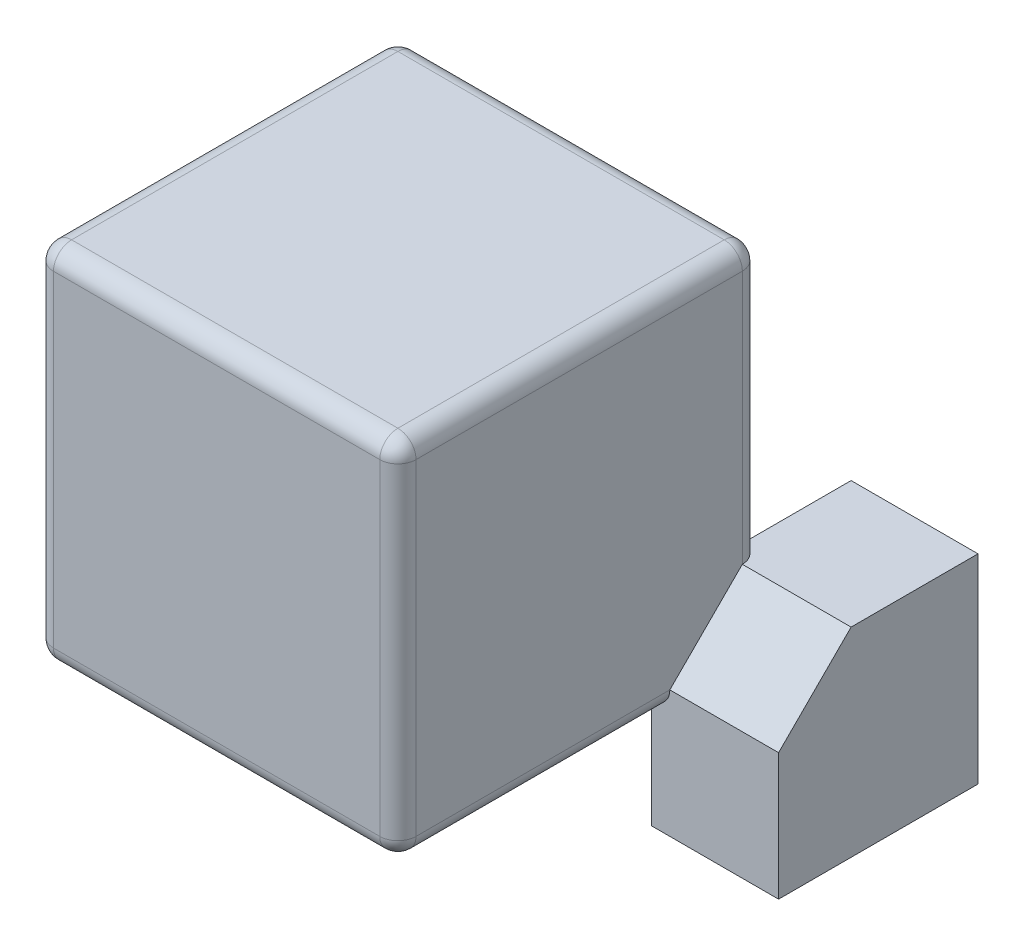
ISO-10303-21;
HEADER;
FILE_DESCRIPTION(('STEP AP214'),'2;1');
FILE_NAME('part.step','',(''),(''),'','','');
FILE_SCHEMA(('AUTOMOTIVE_DESIGN { 1 0 10303 214 1 1 1 1 }'));
ENDSEC;
DATA;
#1=APPLICATION_CONTEXT('core data for automotive mechanical design processes');
#2=APPLICATION_PROTOCOL_DEFINITION('international standard','automotive_design',2000,#1);
#3=PRODUCT_CONTEXT('',#1,'mechanical');
#4=PRODUCT('Part','Part','',(#3));
#5=PRODUCT_RELATED_PRODUCT_CATEGORY('part','',(#4));
#6=PRODUCT_DEFINITION_FORMATION('','',#4);
#7=PRODUCT_DEFINITION_CONTEXT('part definition',#1,'design');
#8=PRODUCT_DEFINITION('design','',#6,#7);
#9=PRODUCT_DEFINITION_SHAPE('','',#8);
#10=(LENGTH_UNIT() NAMED_UNIT(*) SI_UNIT(.MILLI.,.METRE.));
#11=(NAMED_UNIT(*) PLANE_ANGLE_UNIT() SI_UNIT($,.RADIAN.));
#12=(NAMED_UNIT(*) SI_UNIT($,.STERADIAN.) SOLID_ANGLE_UNIT());
#13=UNCERTAINTY_MEASURE_WITH_UNIT(LENGTH_MEASURE(1.E-05),#10,'distance_accuracy_value','');
#14=(GEOMETRIC_REPRESENTATION_CONTEXT(3) GLOBAL_UNCERTAINTY_ASSIGNED_CONTEXT((#13)) GLOBAL_UNIT_ASSIGNED_CONTEXT((#10,
#11,#12)) REPRESENTATION_CONTEXT('',''));
#15=CARTESIAN_POINT('',(0.,0.,0.));
#16=DIRECTION('',(0.,0.,1.));
#17=DIRECTION('',(1.,0.,0.));
#18=AXIS2_PLACEMENT_3D('',#15,#16,#17);
#19=CARTESIAN_POINT('',(-5.,-5.,10.));
#20=DIRECTION('',(0.,1.,0.));
#21=DIRECTION('',(0.,0.,1.));
#22=AXIS2_PLACEMENT_3D('',#19,#20,#21);
#23=PLANE('',#22);
#24=DIRECTION('',(1.,0.,0.));
#25=VECTOR('',#24,1.);
#26=CARTESIAN_POINT('',(-5.,-5.,0.5));
#27=LINE('',#26,#25);
#28=CARTESIAN_POINT('',(-4.5,-5.,0.5));
#29=VERTEX_POINT('',#28);
#30=CARTESIAN_POINT('',(2.5,-5.,0.5));
#31=VERTEX_POINT('',#30);
#32=EDGE_CURVE('E236',#29,#31,#27,.T.);
#33=ORIENTED_EDGE('',*,*,#32,.T.);
#34=DIRECTION('',(-0.707106781186546,0.,-0.707106781186549));
#35=VECTOR('',#34,1.);
#36=CARTESIAN_POINT('',(3.50000000000002,-5.,1.50000000000001));
#37=LINE('',#36,#35);
#38=CARTESIAN_POINT('',(4.5,-5.,2.5));
#39=VERTEX_POINT('',#38);
#40=EDGE_CURVE('E11',#31,#39,#37,.F.);
#41=ORIENTED_EDGE('',*,*,#40,.T.);
#42=DIRECTION('',(0.,0.,-1.));
#43=VECTOR('',#42,1.);
#44=CARTESIAN_POINT('',(4.5,-5.,10.));
#45=LINE('',#44,#43);
#46=CARTESIAN_POINT('',(4.5,-5.,9.5));
#47=VERTEX_POINT('',#46);
#48=EDGE_CURVE('E241',#39,#47,#45,.F.);
#49=ORIENTED_EDGE('',*,*,#48,.T.);
#50=DIRECTION('',(1.,0.,0.));
#51=VECTOR('',#50,1.);
#52=CARTESIAN_POINT('',(-5.,-5.,9.5));
#53=LINE('',#52,#51);
#54=CARTESIAN_POINT('',(-4.5,-5.,9.5));
#55=VERTEX_POINT('',#54);
#56=EDGE_CURVE('E239',#47,#55,#53,.F.);
#57=ORIENTED_EDGE('',*,*,#56,.T.);
#58=DIRECTION('',(0.,0.,-1.));
#59=VECTOR('',#58,1.);
#60=CARTESIAN_POINT('',(-4.5,-5.,10.));
#61=LINE('',#60,#59);
#62=EDGE_CURVE('E234',#55,#29,#61,.T.);
#63=ORIENTED_EDGE('',*,*,#62,.T.);
#64=EDGE_LOOP('',(#33,#41,#49,#57,#63));
#65=FACE_BOUND('',#64,.T.);
#66=ADVANCED_FACE('F37',(#65),#23,.F.);
#67=CARTESIAN_POINT('',(5.,5.,10.));
#68=DIRECTION('',(-1.,0.,0.));
#69=DIRECTION('',(0.,0.,1.));
#70=AXIS2_PLACEMENT_3D('',#67,#68,#69);
#71=PLANE('',#70);
#72=DIRECTION('',(0.,0.,-1.));
#73=VECTOR('',#72,1.);
#74=CARTESIAN_POINT('',(5.,-4.5,10.));
#75=LINE('',#74,#73);
#76=CARTESIAN_POINT('',(5.,-4.5,9.5));
#77=VERTEX_POINT('',#76);
#78=CARTESIAN_POINT('',(5.,-4.5,2.5));
#79=VERTEX_POINT('',#78);
#80=EDGE_CURVE('E206',#77,#79,#75,.T.);
#81=ORIENTED_EDGE('',*,*,#80,.T.);
#82=DIRECTION('',(0.,-0.707106781186546,0.707106781186549));
#83=VECTOR('',#82,1.);
#84=CARTESIAN_POINT('',(5.,-3.50000000000002,1.50000000000001));
#85=LINE('',#84,#83);
#86=CARTESIAN_POINT('',(5.,-2.5,0.5));
#87=VERTEX_POINT('',#86);
#88=EDGE_CURVE('E279',#79,#87,#85,.F.);
#89=ORIENTED_EDGE('',*,*,#88,.T.);
#90=DIRECTION('',(0.,1.,0.));
#91=VECTOR('',#90,1.);
#92=CARTESIAN_POINT('',(5.,5.,0.5));
#93=LINE('',#92,#91);
#94=CARTESIAN_POINT('',(5.,4.5,0.5));
#95=VERTEX_POINT('',#94);
#96=EDGE_CURVE('E214',#87,#95,#93,.T.);
#97=ORIENTED_EDGE('',*,*,#96,.T.);
#98=DIRECTION('',(0.,0.,-1.));
#99=VECTOR('',#98,1.);
#100=CARTESIAN_POINT('',(5.,4.5,10.));
#101=LINE('',#100,#99);
#102=CARTESIAN_POINT('',(5.,4.5,9.5));
#103=VERTEX_POINT('',#102);
#104=EDGE_CURVE('E211',#95,#103,#101,.F.);
#105=ORIENTED_EDGE('',*,*,#104,.T.);
#106=DIRECTION('',(0.,1.,0.));
#107=VECTOR('',#106,1.);
#108=CARTESIAN_POINT('',(5.,-5.,9.5));
#109=LINE('',#108,#107);
#110=EDGE_CURVE('E209',#103,#77,#109,.F.);
#111=ORIENTED_EDGE('',*,*,#110,.T.);
#112=EDGE_LOOP('',(#81,#89,#97,#105,#111));
#113=FACE_BOUND('',#112,.T.);
#114=ADVANCED_FACE('F315',(#113),#71,.F.);
#115=CARTESIAN_POINT('',(-5.,-5.,0.));
#116=DIRECTION('',(0.,0.,1.));
#117=DIRECTION('',(1.,0.,0.));
#118=AXIS2_PLACEMENT_3D('',#115,#116,#117);
#119=PLANE('',#118);
#120=DIRECTION('',(-1.,0.,0.));
#121=VECTOR('',#120,1.);
#122=CARTESIAN_POINT('',(-5.,4.5,0.));
#123=LINE('',#122,#121);
#124=CARTESIAN_POINT('',(-4.5,4.5,0.));
#125=VERTEX_POINT('',#124);
#126=CARTESIAN_POINT('',(4.5,4.5,0.));
#127=VERTEX_POINT('',#126);
#128=EDGE_CURVE('E247',#125,#127,#123,.F.);
#129=ORIENTED_EDGE('',*,*,#128,.T.);
#130=DIRECTION('',(0.,1.,0.));
#131=VECTOR('',#130,1.);
#132=CARTESIAN_POINT('',(4.5,-5.,0.));
#133=LINE('',#132,#131);
#134=CARTESIAN_POINT('',(4.5,-2.5,0.));
#135=VERTEX_POINT('',#134);
#136=EDGE_CURVE('E249',#127,#135,#133,.F.);
#137=ORIENTED_EDGE('',*,*,#136,.T.);
#138=DIRECTION('',(0.707106781186546,0.707106781186549,0.));
#139=VECTOR('',#138,1.);
#140=CARTESIAN_POINT('',(-1.49999999999998,-8.5,0.));
#141=LINE('',#140,#139);
#142=CARTESIAN_POINT('',(2.5,-4.5,0.));
#143=VERTEX_POINT('',#142);
#144=EDGE_CURVE('E45',#135,#143,#141,.F.);
#145=ORIENTED_EDGE('',*,*,#144,.T.);
#146=DIRECTION('',(1.,0.,0.));
#147=VECTOR('',#146,1.);
#148=CARTESIAN_POINT('',(-5.,-4.5,0.));
#149=LINE('',#148,#147);
#150=CARTESIAN_POINT('',(-4.5,-4.5,0.));
#151=VERTEX_POINT('',#150);
#152=EDGE_CURVE('E243',#143,#151,#149,.F.);
#153=ORIENTED_EDGE('',*,*,#152,.T.);
#154=DIRECTION('',(0.,-1.,0.));
#155=VECTOR('',#154,1.);
#156=CARTESIAN_POINT('',(-4.5,-5.,0.));
#157=LINE('',#156,#155);
#158=EDGE_CURVE('E245',#151,#125,#157,.F.);
#159=ORIENTED_EDGE('',*,*,#158,.T.);
#160=EDGE_LOOP('',(#129,#137,#145,#153,#159));
#161=FACE_BOUND('',#160,.T.);
#162=ADVANCED_FACE('F281',(#161),#119,.F.);
#163=CARTESIAN_POINT('',(-5.,5.,10.));
#164=DIRECTION('',(1.,0.,0.));
#165=DIRECTION('',(0.,0.,-1.));
#166=AXIS2_PLACEMENT_3D('',#163,#164,#165);
#167=PLANE('',#166);
#168=DIRECTION('',(0.,0.,-1.));
#169=VECTOR('',#168,1.);
#170=CARTESIAN_POINT('',(-5.,-4.5,10.));
#171=LINE('',#170,#169);
#172=CARTESIAN_POINT('',(-5.,-4.5,0.5));
#173=VERTEX_POINT('',#172);
#174=CARTESIAN_POINT('',(-5.,-4.5,9.5));
#175=VERTEX_POINT('',#174);
#176=EDGE_CURVE('E225',#173,#175,#171,.F.);
#177=ORIENTED_EDGE('',*,*,#176,.T.);
#178=DIRECTION('',(0.,-1.,0.));
#179=VECTOR('',#178,1.);
#180=CARTESIAN_POINT('',(-5.,5.,9.5));
#181=LINE('',#180,#179);
#182=CARTESIAN_POINT('',(-5.,4.5,9.5));
#183=VERTEX_POINT('',#182);
#184=EDGE_CURVE('E231',#175,#183,#181,.F.);
#185=ORIENTED_EDGE('',*,*,#184,.T.);
#186=DIRECTION('',(0.,0.,-1.));
#187=VECTOR('',#186,1.);
#188=CARTESIAN_POINT('',(-5.,4.5,10.));
#189=LINE('',#188,#187);
#190=CARTESIAN_POINT('',(-5.,4.5,0.5));
#191=VERTEX_POINT('',#190);
#192=EDGE_CURVE('E229',#183,#191,#189,.T.);
#193=ORIENTED_EDGE('',*,*,#192,.T.);
#194=DIRECTION('',(0.,-1.,0.));
#195=VECTOR('',#194,1.);
#196=CARTESIAN_POINT('',(-5.,5.,0.5));
#197=LINE('',#196,#195);
#198=EDGE_CURVE('E227',#191,#173,#197,.T.);
#199=ORIENTED_EDGE('',*,*,#198,.T.);
#200=EDGE_LOOP('',(#177,#185,#193,#199));
#201=FACE_BOUND('',#200,.T.);
#202=ADVANCED_FACE('F39',(#201),#167,.F.);
#203=CARTESIAN_POINT('',(-5.,5.,10.));
#204=DIRECTION('',(0.,-1.,0.));
#205=DIRECTION('',(0.,0.,-1.));
#206=AXIS2_PLACEMENT_3D('',#203,#204,#205);
#207=PLANE('',#206);
#208=DIRECTION('',(-1.,0.,0.));
#209=VECTOR('',#208,1.);
#210=CARTESIAN_POINT('',(5.,5.,9.5));
#211=LINE('',#210,#209);
#212=CARTESIAN_POINT('',(-4.5,5.,9.5));
#213=VERTEX_POINT('',#212);
#214=CARTESIAN_POINT('',(4.5,5.,9.5));
#215=VERTEX_POINT('',#214);
#216=EDGE_CURVE('E201',#213,#215,#211,.F.);
#217=ORIENTED_EDGE('',*,*,#216,.T.);
#218=DIRECTION('',(0.,0.,-1.));
#219=VECTOR('',#218,1.);
#220=CARTESIAN_POINT('',(4.5,5.,10.));
#221=LINE('',#220,#219);
#222=CARTESIAN_POINT('',(4.5,5.,0.5));
#223=VERTEX_POINT('',#222);
#224=EDGE_CURVE('E203',#215,#223,#221,.T.);
#225=ORIENTED_EDGE('',*,*,#224,.T.);
#226=DIRECTION('',(-1.,0.,0.));
#227=VECTOR('',#226,1.);
#228=CARTESIAN_POINT('',(-5.,5.,0.5));
#229=LINE('',#228,#227);
#230=CARTESIAN_POINT('',(-4.5,5.,0.5));
#231=VERTEX_POINT('',#230);
#232=EDGE_CURVE('E199',#223,#231,#229,.T.);
#233=ORIENTED_EDGE('',*,*,#232,.T.);
#234=DIRECTION('',(0.,0.,-1.));
#235=VECTOR('',#234,1.);
#236=CARTESIAN_POINT('',(-4.5,5.,10.));
#237=LINE('',#236,#235);
#238=EDGE_CURVE('E197',#231,#213,#237,.F.);
#239=ORIENTED_EDGE('',*,*,#238,.T.);
#240=EDGE_LOOP('',(#217,#225,#233,#239));
#241=FACE_BOUND('',#240,.T.);
#242=ADVANCED_FACE('F445',(#241),#207,.F.);
#243=CARTESIAN_POINT('',(-5.,-5.,10.));
#244=DIRECTION('',(0.,0.,1.));
#245=DIRECTION('',(1.,0.,0.));
#246=AXIS2_PLACEMENT_3D('',#243,#244,#245);
#247=PLANE('',#246);
#248=DIRECTION('',(-1.,0.,0.));
#249=VECTOR('',#248,1.);
#250=CARTESIAN_POINT('',(-5.,4.5,10.));
#251=LINE('',#250,#249);
#252=CARTESIAN_POINT('',(4.5,4.5,10.));
#253=VERTEX_POINT('',#252);
#254=CARTESIAN_POINT('',(-4.5,4.5,10.));
#255=VERTEX_POINT('',#254);
#256=EDGE_CURVE('E220',#253,#255,#251,.T.);
#257=ORIENTED_EDGE('',*,*,#256,.T.);
#258=DIRECTION('',(0.,-1.,0.));
#259=VECTOR('',#258,1.);
#260=CARTESIAN_POINT('',(-4.5,-5.,10.));
#261=LINE('',#260,#259);
#262=CARTESIAN_POINT('',(-4.5,-4.5,10.));
#263=VERTEX_POINT('',#262);
#264=EDGE_CURVE('E222',#255,#263,#261,.T.);
#265=ORIENTED_EDGE('',*,*,#264,.T.);
#266=DIRECTION('',(1.,0.,0.));
#267=VECTOR('',#266,1.);
#268=CARTESIAN_POINT('',(5.,-4.5,10.));
#269=LINE('',#268,#267);
#270=CARTESIAN_POINT('',(4.5,-4.5,10.));
#271=VERTEX_POINT('',#270);
#272=EDGE_CURVE('E216',#263,#271,#269,.T.);
#273=ORIENTED_EDGE('',*,*,#272,.T.);
#274=DIRECTION('',(0.,1.,0.));
#275=VECTOR('',#274,1.);
#276=CARTESIAN_POINT('',(4.5,5.,10.));
#277=LINE('',#276,#275);
#278=EDGE_CURVE('E218',#271,#253,#277,.T.);
#279=ORIENTED_EDGE('',*,*,#278,.T.);
#280=EDGE_LOOP('',(#257,#265,#273,#279));
#281=FACE_BOUND('',#280,.T.);
#282=ADVANCED_FACE('F361',(#281),#247,.T.);
#283=CARTESIAN_POINT('',(8.,-2.5,2.5));
#284=DIRECTION('',(0.,0.,-1.));
#285=DIRECTION('',(0.,1.,0.));
#286=AXIS2_PLACEMENT_3D('',#283,#284,#285);
#287=PLANE('',#286);
#288=DIRECTION('',(0.,-1.,0.));
#289=VECTOR('',#288,1.);
#290=CARTESIAN_POINT('',(8.,-2.5,2.5));
#291=LINE('',#290,#289);
#292=CARTESIAN_POINT('',(8.,-4.5,2.5));
#293=VERTEX_POINT('',#292);
#294=CARTESIAN_POINT('',(8.,-8.,2.5));
#295=VERTEX_POINT('',#294);
#296=EDGE_CURVE('E183',#293,#295,#291,.T.);
#297=ORIENTED_EDGE('',*,*,#296,.F.);
#298=DIRECTION('',(-1.,0.,0.));
#299=VECTOR('',#298,1.);
#300=CARTESIAN_POINT('',(8.,-4.5,2.5));
#301=LINE('',#300,#299);
#302=EDGE_CURVE('E263',#293,#79,#301,.T.);
#303=ORIENTED_EDGE('',*,*,#302,.T.);
#304=CARTESIAN_POINT('',(4.5,-4.5,2.5));
#305=DIRECTION('',(0.,0.,-1.));
#306=DIRECTION('',(0.,1.,0.));
#307=AXIS2_PLACEMENT_3D('',#304,#305,#306);
#308=CIRCLE('',#307,0.5);
#309=EDGE_CURVE('E255',#79,#39,#308,.T.);
#310=ORIENTED_EDGE('',*,*,#309,.T.);
#311=DIRECTION('',(0.,-1.,0.));
#312=VECTOR('',#311,1.);
#313=CARTESIAN_POINT('',(4.5,-2.5,2.5));
#314=LINE('',#313,#312);
#315=CARTESIAN_POINT('',(4.5,-8.,2.5));
#316=VERTEX_POINT('',#315);
#317=EDGE_CURVE('E260',#39,#316,#314,.T.);
#318=ORIENTED_EDGE('',*,*,#317,.T.);
#319=DIRECTION('',(-1.,0.,0.));
#320=VECTOR('',#319,1.);
#321=CARTESIAN_POINT('',(8.,-8.,2.5));
#322=LINE('',#321,#320);
#323=EDGE_CURVE('E179',#295,#316,#322,.T.);
#324=ORIENTED_EDGE('',*,*,#323,.F.);
#325=EDGE_LOOP('',(#297,#303,#310,#318,#324));
#326=FACE_BOUND('',#325,.T.);
#327=ADVANCED_FACE('F309',(#326),#287,.F.);
#328=CARTESIAN_POINT('',(8.,-2.5,2.5));
#329=DIRECTION('',(0.,-1.,0.));
#330=DIRECTION('',(0.,0.,-1.));
#331=AXIS2_PLACEMENT_3D('',#328,#329,#330);
#332=PLANE('',#331);
#333=CARTESIAN_POINT('',(4.5,-2.5,0.5));
#334=DIRECTION('',(0.,-1.,0.));
#335=DIRECTION('',(0.,0.,-1.));
#336=AXIS2_PLACEMENT_3D('',#333,#334,#335);
#337=CIRCLE('',#336,0.5);
#338=EDGE_CURVE('E252',#135,#87,#337,.T.);
#339=ORIENTED_EDGE('',*,*,#338,.T.);
#340=DIRECTION('',(1.,0.,0.));
#341=VECTOR('',#340,1.);
#342=CARTESIAN_POINT('',(8.,-2.5,0.499999999999993));
#343=LINE('',#342,#341);
#344=CARTESIAN_POINT('',(8.,-2.5,0.499999999999993));
#345=VERTEX_POINT('',#344);
#346=EDGE_CURVE('E269',#87,#345,#343,.T.);
#347=ORIENTED_EDGE('',*,*,#346,.T.);
#348=DIRECTION('',(0.,0.,1.));
#349=VECTOR('',#348,1.);
#350=CARTESIAN_POINT('',(8.,-2.5,2.5));
#351=LINE('',#350,#349);
#352=CARTESIAN_POINT('',(8.,-2.5,-3.));
#353=VERTEX_POINT('',#352);
#354=EDGE_CURVE('E191',#353,#345,#351,.T.);
#355=ORIENTED_EDGE('',*,*,#354,.F.);
#356=DIRECTION('',(-1.,0.,0.));
#357=VECTOR('',#356,1.);
#358=CARTESIAN_POINT('',(8.,-2.5,-3.));
#359=LINE('',#358,#357);
#360=CARTESIAN_POINT('',(4.5,-2.5,-3.));
#361=VERTEX_POINT('',#360);
#362=EDGE_CURVE('E180',#353,#361,#359,.T.);
#363=ORIENTED_EDGE('',*,*,#362,.T.);
#364=DIRECTION('',(0.,0.,1.));
#365=VECTOR('',#364,1.);
#366=CARTESIAN_POINT('',(4.5,-2.5,2.5));
#367=LINE('',#366,#365);
#368=EDGE_CURVE('E266',#361,#135,#367,.T.);
#369=ORIENTED_EDGE('',*,*,#368,.T.);
#370=EDGE_LOOP('',(#339,#347,#355,#363,#369));
#371=FACE_BOUND('',#370,.T.);
#372=ADVANCED_FACE('F299',(#371),#332,.F.);
#373=CARTESIAN_POINT('',(2.5,-2.5,2.5));
#374=DIRECTION('',(1.,0.,0.));
#375=DIRECTION('',(0.,0.,-1.));
#376=AXIS2_PLACEMENT_3D('',#373,#374,#375);
#377=PLANE('',#376);
#378=CARTESIAN_POINT('',(2.5,-4.5,0.5));
#379=DIRECTION('',(1.,0.,0.));
#380=DIRECTION('',(0.,0.,-1.));
#381=AXIS2_PLACEMENT_3D('',#378,#379,#380);
#382=CIRCLE('',#381,0.5);
#383=EDGE_CURVE('E258',#31,#143,#382,.T.);
#384=ORIENTED_EDGE('',*,*,#383,.T.);
#385=DIRECTION('',(0.,0.,-1.));
#386=VECTOR('',#385,1.);
#387=CARTESIAN_POINT('',(2.5,-4.50000000000001,2.5));
#388=LINE('',#387,#386);
#389=CARTESIAN_POINT('',(2.5,-4.50000000000001,-3.));
#390=VERTEX_POINT('',#389);
#391=EDGE_CURVE('E60',#143,#390,#388,.T.);
#392=ORIENTED_EDGE('',*,*,#391,.T.);
#393=DIRECTION('',(0.,1.,0.));
#394=VECTOR('',#393,1.);
#395=CARTESIAN_POINT('',(2.5,-2.5,-3.));
#396=LINE('',#395,#394);
#397=CARTESIAN_POINT('',(2.5,-8.,-3.));
#398=VERTEX_POINT('',#397);
#399=EDGE_CURVE('E171',#398,#390,#396,.T.);
#400=ORIENTED_EDGE('',*,*,#399,.F.);
#401=DIRECTION('',(0.,0.,-1.));
#402=VECTOR('',#401,1.);
#403=CARTESIAN_POINT('',(2.5,-8.,2.5));
#404=LINE('',#403,#402);
#405=CARTESIAN_POINT('',(2.5,-8.,0.499999999999992));
#406=VERTEX_POINT('',#405);
#407=EDGE_CURVE('E164',#406,#398,#404,.T.);
#408=ORIENTED_EDGE('',*,*,#407,.F.);
#409=DIRECTION('',(0.,1.,0.));
#410=VECTOR('',#409,1.);
#411=CARTESIAN_POINT('',(2.5,-2.5,0.499999999999992));
#412=LINE('',#411,#410);
#413=EDGE_CURVE('E273',#406,#31,#412,.T.);
#414=ORIENTED_EDGE('',*,*,#413,.T.);
#415=EDGE_LOOP('',(#384,#392,#400,#408,#414));
#416=FACE_BOUND('',#415,.T.);
#417=ADVANCED_FACE('F182',(#416),#377,.F.);
#418=CARTESIAN_POINT('',(8.,-8.,2.5));
#419=DIRECTION('',(0.,1.,0.));
#420=DIRECTION('',(0.,0.,1.));
#421=AXIS2_PLACEMENT_3D('',#418,#419,#420);
#422=PLANE('',#421);
#423=ORIENTED_EDGE('',*,*,#323,.T.);
#424=DIRECTION('',(0.707106781186546,0.,0.707106781186549));
#425=VECTOR('',#424,1.);
#426=CARTESIAN_POINT('',(4.5,-8.,2.5));
#427=LINE('',#426,#425);
#428=EDGE_CURVE('E52',#316,#406,#427,.F.);
#429=ORIENTED_EDGE('',*,*,#428,.T.);
#430=ORIENTED_EDGE('',*,*,#407,.T.);
#431=DIRECTION('',(-1.,0.,0.));
#432=VECTOR('',#431,1.);
#433=CARTESIAN_POINT('',(8.,-8.,-3.));
#434=LINE('',#433,#432);
#435=CARTESIAN_POINT('',(8.,-8.,-3.));
#436=VERTEX_POINT('',#435);
#437=EDGE_CURVE('E168',#436,#398,#434,.T.);
#438=ORIENTED_EDGE('',*,*,#437,.F.);
#439=DIRECTION('',(0.,0.,-1.));
#440=VECTOR('',#439,1.);
#441=CARTESIAN_POINT('',(8.,-8.,2.5));
#442=LINE('',#441,#440);
#443=EDGE_CURVE('E185',#295,#436,#442,.T.);
#444=ORIENTED_EDGE('',*,*,#443,.F.);
#445=EDGE_LOOP('',(#423,#429,#430,#438,#444));
#446=FACE_BOUND('',#445,.T.);
#447=ADVANCED_FACE('F166',(#446),#422,.F.);
#448=CARTESIAN_POINT('',(8.,-2.5,-3.));
#449=DIRECTION('',(0.,0.,1.));
#450=DIRECTION('',(0.,-1.,0.));
#451=AXIS2_PLACEMENT_3D('',#448,#449,#450);
#452=PLANE('',#451);
#453=ORIENTED_EDGE('',*,*,#399,.T.);
#454=DIRECTION('',(-0.707106781186546,-0.707106781186549,0.));
#455=VECTOR('',#454,1.);
#456=CARTESIAN_POINT('',(4.5,-2.5,-3.));
#457=LINE('',#456,#455);
#458=EDGE_CURVE('E276',#390,#361,#457,.F.);
#459=ORIENTED_EDGE('',*,*,#458,.T.);
#460=ORIENTED_EDGE('',*,*,#362,.F.);
#461=DIRECTION('',(0.,1.,0.));
#462=VECTOR('',#461,1.);
#463=CARTESIAN_POINT('',(8.,-2.5,-3.));
#464=LINE('',#463,#462);
#465=EDGE_CURVE('E178',#436,#353,#464,.T.);
#466=ORIENTED_EDGE('',*,*,#465,.F.);
#467=ORIENTED_EDGE('',*,*,#437,.T.);
#468=EDGE_LOOP('',(#453,#459,#460,#466,#467));
#469=FACE_BOUND('',#468,.T.);
#470=ADVANCED_FACE('F175',(#469),#452,.F.);
#471=CARTESIAN_POINT('',(8.,-2.5,2.5));
#472=DIRECTION('',(1.,0.,0.));
#473=DIRECTION('',(0.,0.,-1.));
#474=AXIS2_PLACEMENT_3D('',#471,#472,#473);
#475=PLANE('',#474);
#476=ORIENTED_EDGE('',*,*,#354,.T.);
#477=DIRECTION('',(0.,0.707106781186546,-0.707106781186549));
#478=VECTOR('',#477,1.);
#479=CARTESIAN_POINT('',(8.,-3.5,1.5));
#480=LINE('',#479,#478);
#481=EDGE_CURVE('E271',#345,#293,#480,.F.);
#482=ORIENTED_EDGE('',*,*,#481,.T.);
#483=ORIENTED_EDGE('',*,*,#296,.T.);
#484=ORIENTED_EDGE('',*,*,#443,.T.);
#485=ORIENTED_EDGE('',*,*,#465,.T.);
#486=EDGE_LOOP('',(#476,#482,#483,#484,#485));
#487=FACE_BOUND('',#486,.T.);
#488=ADVANCED_FACE('F303',(#487),#475,.T.);
#489=CARTESIAN_POINT('',(-4.5,-4.5,10.));
#490=DIRECTION('',(0.,0.,-1.));
#491=DIRECTION('',(-1.,0.,0.));
#492=AXIS2_PLACEMENT_3D('',#489,#490,#491);
#493=CYLINDRICAL_SURFACE('',#492,0.5);
#494=CARTESIAN_POINT('',(-4.5,-4.5,0.5));
#495=DIRECTION('',(0.,0.,-1.));
#496=DIRECTION('',(-1.,0.,0.));
#497=AXIS2_PLACEMENT_3D('',#494,#495,#496);
#498=CIRCLE('',#497,0.5);
#499=EDGE_CURVE('E333',#29,#173,#498,.T.);
#500=ORIENTED_EDGE('',*,*,#499,.F.);
#501=ORIENTED_EDGE('',*,*,#62,.F.);
#502=CARTESIAN_POINT('',(-4.5,-4.5,9.5));
#503=DIRECTION('',(0.,0.,1.));
#504=DIRECTION('',(1.,0.,0.));
#505=AXIS2_PLACEMENT_3D('',#502,#503,#504);
#506=CIRCLE('',#505,0.5);
#507=EDGE_CURVE('E172',#175,#55,#506,.T.);
#508=ORIENTED_EDGE('',*,*,#507,.F.);
#509=ORIENTED_EDGE('',*,*,#176,.F.);
#510=EDGE_LOOP('',(#500,#501,#508,#509));
#511=FACE_BOUND('',#510,.T.);
#512=ADVANCED_FACE('F334',(#511),#493,.T.);
#513=CARTESIAN_POINT('',(-5.,-4.5,0.5));
#514=DIRECTION('',(1.,0.,0.));
#515=DIRECTION('',(0.,0.,-1.));
#516=AXIS2_PLACEMENT_3D('',#513,#514,#515);
#517=CYLINDRICAL_SURFACE('',#516,0.5);
#518=ORIENTED_EDGE('',*,*,#383,.F.);
#519=ORIENTED_EDGE('',*,*,#32,.F.);
#520=CARTESIAN_POINT('',(-4.5,-4.5,0.5));
#521=DIRECTION('',(-1.,0.,0.));
#522=DIRECTION('',(0.,0.,1.));
#523=AXIS2_PLACEMENT_3D('',#520,#521,#522);
#524=CIRCLE('',#523,0.5);
#525=EDGE_CURVE('E294',#151,#29,#524,.T.);
#526=ORIENTED_EDGE('',*,*,#525,.F.);
#527=ORIENTED_EDGE('',*,*,#152,.F.);
#528=EDGE_LOOP('',(#518,#519,#526,#527));
#529=FACE_BOUND('',#528,.T.);
#530=ADVANCED_FACE('F292',(#529),#517,.T.);
#531=CARTESIAN_POINT('',(-4.5,-4.5,9.5));
#532=DIRECTION('',(0.,0.,1.));
#533=DIRECTION('',(1.,0.,0.));
#534=AXIS2_PLACEMENT_3D('',#531,#532,#533);
#535=SPHERICAL_SURFACE('',#534,0.5);
#536=CARTESIAN_POINT('',(-4.5,-4.5,9.5));
#537=DIRECTION('',(0.,-1.,0.));
#538=DIRECTION('',(0.,0.,-1.));
#539=AXIS2_PLACEMENT_3D('',#536,#537,#538);
#540=CIRCLE('',#539,0.5);
#541=EDGE_CURVE('E346',#175,#263,#540,.F.);
#542=ORIENTED_EDGE('',*,*,#541,.F.);
#543=ORIENTED_EDGE('',*,*,#507,.T.);
#544=CARTESIAN_POINT('',(-4.5,-4.5,9.5));
#545=DIRECTION('',(-1.,0.,0.));
#546=DIRECTION('',(0.,0.,1.));
#547=AXIS2_PLACEMENT_3D('',#544,#545,#546);
#548=CIRCLE('',#547,0.5);
#549=EDGE_CURVE('E343',#263,#55,#548,.F.);
#550=ORIENTED_EDGE('',*,*,#549,.F.);
#551=EDGE_LOOP('',(#542,#543,#550));
#552=FACE_BOUND('',#551,.T.);
#553=ADVANCED_FACE('F352',(#552),#535,.T.);
#554=CARTESIAN_POINT('',(-4.5,-4.5,0.5));
#555=DIRECTION('',(0.,0.,1.));
#556=DIRECTION('',(1.,0.,0.));
#557=AXIS2_PLACEMENT_3D('',#554,#555,#556);
#558=SPHERICAL_SURFACE('',#557,0.5);
#559=ORIENTED_EDGE('',*,*,#525,.T.);
#560=ORIENTED_EDGE('',*,*,#499,.T.);
#561=CARTESIAN_POINT('',(-4.5,-4.5,0.5));
#562=DIRECTION('',(0.,-1.,0.));
#563=DIRECTION('',(0.,0.,-1.));
#564=AXIS2_PLACEMENT_3D('',#561,#562,#563);
#565=CIRCLE('',#564,0.5);
#566=EDGE_CURVE('E341',#151,#173,#565,.F.);
#567=ORIENTED_EDGE('',*,*,#566,.F.);
#568=EDGE_LOOP('',(#559,#560,#567));
#569=FACE_BOUND('',#568,.T.);
#570=ADVANCED_FACE('F340',(#569),#558,.T.);
#571=CARTESIAN_POINT('',(4.5,-4.5,10.));
#572=DIRECTION('',(0.,0.,-1.));
#573=DIRECTION('',(-1.,0.,0.));
#574=AXIS2_PLACEMENT_3D('',#571,#572,#573);
#575=CYLINDRICAL_SURFACE('',#574,0.5);
#576=ORIENTED_EDGE('',*,*,#309,.F.);
#577=ORIENTED_EDGE('',*,*,#80,.F.);
#578=CARTESIAN_POINT('',(4.5,-4.5,9.5));
#579=DIRECTION('',(0.,0.,1.));
#580=DIRECTION('',(1.,0.,0.));
#581=AXIS2_PLACEMENT_3D('',#578,#579,#580);
#582=CIRCLE('',#581,0.5);
#583=EDGE_CURVE('E322',#47,#77,#582,.T.);
#584=ORIENTED_EDGE('',*,*,#583,.F.);
#585=ORIENTED_EDGE('',*,*,#48,.F.);
#586=EDGE_LOOP('',(#576,#577,#584,#585));
#587=FACE_BOUND('',#586,.T.);
#588=ADVANCED_FACE('F320',(#587),#575,.T.);
#589=CARTESIAN_POINT('',(-5.,-4.5,9.5));
#590=DIRECTION('',(-1.,0.,0.));
#591=DIRECTION('',(0.,0.,1.));
#592=AXIS2_PLACEMENT_3D('',#589,#590,#591);
#593=CYLINDRICAL_SURFACE('',#592,0.5);
#594=ORIENTED_EDGE('',*,*,#549,.T.);
#595=ORIENTED_EDGE('',*,*,#56,.F.);
#596=CARTESIAN_POINT('',(4.5,-4.5,9.5));
#597=DIRECTION('',(1.,0.,0.));
#598=DIRECTION('',(0.,1.,0.));
#599=AXIS2_PLACEMENT_3D('',#596,#597,#598);
#600=CIRCLE('',#599,0.5);
#601=EDGE_CURVE('E358',#271,#47,#600,.T.);
#602=ORIENTED_EDGE('',*,*,#601,.F.);
#603=ORIENTED_EDGE('',*,*,#272,.F.);
#604=EDGE_LOOP('',(#594,#595,#602,#603));
#605=FACE_BOUND('',#604,.T.);
#606=ADVANCED_FACE('F356',(#605),#593,.T.);
#607=CARTESIAN_POINT('',(-4.5,-5.,9.5));
#608=DIRECTION('',(0.,1.,0.));
#609=DIRECTION('',(0.,0.,1.));
#610=AXIS2_PLACEMENT_3D('',#607,#608,#609);
#611=CYLINDRICAL_SURFACE('',#610,0.5);
#612=ORIENTED_EDGE('',*,*,#541,.T.);
#613=ORIENTED_EDGE('',*,*,#264,.F.);
#614=CARTESIAN_POINT('',(-4.5,4.5,9.5));
#615=DIRECTION('',(0.,1.,0.));
#616=DIRECTION('',(0.,0.,1.));
#617=AXIS2_PLACEMENT_3D('',#614,#615,#616);
#618=CIRCLE('',#617,0.5);
#619=EDGE_CURVE('E369',#183,#255,#618,.T.);
#620=ORIENTED_EDGE('',*,*,#619,.F.);
#621=ORIENTED_EDGE('',*,*,#184,.F.);
#622=EDGE_LOOP('',(#612,#613,#620,#621));
#623=FACE_BOUND('',#622,.T.);
#624=ADVANCED_FACE('F368',(#623),#611,.T.);
#625=CARTESIAN_POINT('',(-4.5,4.5,10.));
#626=DIRECTION('',(0.,0.,-1.));
#627=DIRECTION('',(-1.,0.,0.));
#628=AXIS2_PLACEMENT_3D('',#625,#626,#627);
#629=CYLINDRICAL_SURFACE('',#628,0.5);
#630=CARTESIAN_POINT('',(-4.5,4.5,0.5));
#631=DIRECTION('',(0.,0.,-1.));
#632=DIRECTION('',(-1.,0.,0.));
#633=AXIS2_PLACEMENT_3D('',#630,#631,#632);
#634=CIRCLE('',#633,0.5);
#635=EDGE_CURVE('E397',#191,#231,#634,.T.);
#636=ORIENTED_EDGE('',*,*,#635,.F.);
#637=ORIENTED_EDGE('',*,*,#192,.F.);
#638=CARTESIAN_POINT('',(-4.5,4.5,9.5));
#639=DIRECTION('',(0.,0.,1.));
#640=DIRECTION('',(1.,0.,0.));
#641=AXIS2_PLACEMENT_3D('',#638,#639,#640);
#642=CIRCLE('',#641,0.5);
#643=EDGE_CURVE('E378',#213,#183,#642,.T.);
#644=ORIENTED_EDGE('',*,*,#643,.F.);
#645=ORIENTED_EDGE('',*,*,#238,.F.);
#646=EDGE_LOOP('',(#636,#637,#644,#645));
#647=FACE_BOUND('',#646,.T.);
#648=ADVANCED_FACE('F448',(#647),#629,.T.);
#649=CARTESIAN_POINT('',(-4.5,5.,0.5));
#650=DIRECTION('',(0.,-1.,0.));
#651=DIRECTION('',(0.,0.,-1.));
#652=AXIS2_PLACEMENT_3D('',#649,#650,#651);
#653=CYLINDRICAL_SURFACE('',#652,0.5);
#654=ORIENTED_EDGE('',*,*,#566,.T.);
#655=ORIENTED_EDGE('',*,*,#198,.F.);
#656=CARTESIAN_POINT('',(-4.5,4.5,0.5));
#657=DIRECTION('',(0.,1.,0.));
#658=DIRECTION('',(0.,0.,1.));
#659=AXIS2_PLACEMENT_3D('',#656,#657,#658);
#660=CIRCLE('',#659,0.5);
#661=EDGE_CURVE('E388',#125,#191,#660,.T.);
#662=ORIENTED_EDGE('',*,*,#661,.F.);
#663=ORIENTED_EDGE('',*,*,#158,.F.);
#664=EDGE_LOOP('',(#654,#655,#662,#663));
#665=FACE_BOUND('',#664,.T.);
#666=ADVANCED_FACE('F405',(#665),#653,.T.);
#667=CARTESIAN_POINT('',(4.5,-4.5,9.5));
#668=DIRECTION('',(0.,0.,1.));
#669=DIRECTION('',(1.,0.,0.));
#670=AXIS2_PLACEMENT_3D('',#667,#668,#669);
#671=SPHERICAL_SURFACE('',#670,0.5);
#672=ORIENTED_EDGE('',*,*,#601,.T.);
#673=ORIENTED_EDGE('',*,*,#583,.T.);
#674=CARTESIAN_POINT('',(4.5,-4.5,9.5));
#675=DIRECTION('',(0.,-1.,0.));
#676=DIRECTION('',(0.,0.,-1.));
#677=AXIS2_PLACEMENT_3D('',#674,#675,#676);
#678=CIRCLE('',#677,0.5);
#679=EDGE_CURVE('E384',#271,#77,#678,.F.);
#680=ORIENTED_EDGE('',*,*,#679,.F.);
#681=EDGE_LOOP('',(#672,#673,#680));
#682=FACE_BOUND('',#681,.T.);
#683=ADVANCED_FACE('F495',(#682),#671,.T.);
#684=CARTESIAN_POINT('',(-4.5,4.5,9.5));
#685=DIRECTION('',(0.,0.,1.));
#686=DIRECTION('',(1.,0.,0.));
#687=AXIS2_PLACEMENT_3D('',#684,#685,#686);
#688=SPHERICAL_SURFACE('',#687,0.5);
#689=ORIENTED_EDGE('',*,*,#643,.T.);
#690=ORIENTED_EDGE('',*,*,#619,.T.);
#691=CARTESIAN_POINT('',(-4.5,4.5,9.5));
#692=DIRECTION('',(-1.,0.,0.));
#693=DIRECTION('',(0.,0.,1.));
#694=AXIS2_PLACEMENT_3D('',#691,#692,#693);
#695=CIRCLE('',#694,0.5);
#696=EDGE_CURVE('E375',#213,#255,#695,.F.);
#697=ORIENTED_EDGE('',*,*,#696,.F.);
#698=EDGE_LOOP('',(#689,#690,#697));
#699=FACE_BOUND('',#698,.T.);
#700=ADVANCED_FACE('F374',(#699),#688,.T.);
#701=CARTESIAN_POINT('',(-4.5,4.5,0.5));
#702=DIRECTION('',(0.,0.,1.));
#703=DIRECTION('',(1.,0.,0.));
#704=AXIS2_PLACEMENT_3D('',#701,#702,#703);
#705=SPHERICAL_SURFACE('',#704,0.5);
#706=ORIENTED_EDGE('',*,*,#661,.T.);
#707=ORIENTED_EDGE('',*,*,#635,.T.);
#708=CARTESIAN_POINT('',(-4.5,4.5,0.5));
#709=DIRECTION('',(-1.,0.,0.));
#710=DIRECTION('',(0.,0.,1.));
#711=AXIS2_PLACEMENT_3D('',#708,#709,#710);
#712=CIRCLE('',#711,0.5);
#713=EDGE_CURVE('E385',#125,#231,#712,.F.);
#714=ORIENTED_EDGE('',*,*,#713,.F.);
#715=EDGE_LOOP('',(#706,#707,#714));
#716=FACE_BOUND('',#715,.T.);
#717=ADVANCED_FACE('F501',(#716),#705,.T.);
#718=CARTESIAN_POINT('',(4.5,-5.,9.5));
#719=DIRECTION('',(0.,-1.,0.));
#720=DIRECTION('',(0.,0.,-1.));
#721=AXIS2_PLACEMENT_3D('',#718,#719,#720);
#722=CYLINDRICAL_SURFACE('',#721,0.5);
#723=ORIENTED_EDGE('',*,*,#679,.T.);
#724=ORIENTED_EDGE('',*,*,#110,.F.);
#725=CARTESIAN_POINT('',(4.5,4.5,9.5));
#726=DIRECTION('',(0.,1.,0.));
#727=DIRECTION('',(-1.,0.,0.));
#728=AXIS2_PLACEMENT_3D('',#725,#726,#727);
#729=CIRCLE('',#728,0.5);
#730=EDGE_CURVE('E391',#253,#103,#729,.T.);
#731=ORIENTED_EDGE('',*,*,#730,.F.);
#732=ORIENTED_EDGE('',*,*,#278,.F.);
#733=EDGE_LOOP('',(#723,#724,#731,#732));
#734=FACE_BOUND('',#733,.T.);
#735=ADVANCED_FACE('F441',(#734),#722,.T.);
#736=CARTESIAN_POINT('',(-5.,4.5,9.5));
#737=DIRECTION('',(1.,0.,0.));
#738=DIRECTION('',(0.,0.,-1.));
#739=AXIS2_PLACEMENT_3D('',#736,#737,#738);
#740=CYLINDRICAL_SURFACE('',#739,0.5);
#741=ORIENTED_EDGE('',*,*,#696,.T.);
#742=ORIENTED_EDGE('',*,*,#256,.F.);
#743=CARTESIAN_POINT('',(4.5,4.5,9.5));
#744=DIRECTION('',(1.,0.,0.));
#745=DIRECTION('',(0.,0.,-1.));
#746=AXIS2_PLACEMENT_3D('',#743,#744,#745);
#747=CIRCLE('',#746,0.5);
#748=EDGE_CURVE('E425',#215,#253,#747,.T.);
#749=ORIENTED_EDGE('',*,*,#748,.F.);
#750=ORIENTED_EDGE('',*,*,#216,.F.);
#751=EDGE_LOOP('',(#741,#742,#749,#750));
#752=FACE_BOUND('',#751,.T.);
#753=ADVANCED_FACE('F381',(#752),#740,.T.);
#754=CARTESIAN_POINT('',(-5.,4.5,0.5));
#755=DIRECTION('',(-1.,0.,0.));
#756=DIRECTION('',(0.,0.,1.));
#757=AXIS2_PLACEMENT_3D('',#754,#755,#756);
#758=CYLINDRICAL_SURFACE('',#757,0.5);
#759=ORIENTED_EDGE('',*,*,#713,.T.);
#760=ORIENTED_EDGE('',*,*,#232,.F.);
#761=CARTESIAN_POINT('',(4.5,4.5,0.5));
#762=DIRECTION('',(1.,0.,0.));
#763=DIRECTION('',(0.,1.,0.));
#764=AXIS2_PLACEMENT_3D('',#761,#762,#763);
#765=CIRCLE('',#764,0.5);
#766=EDGE_CURVE('E421',#127,#223,#765,.T.);
#767=ORIENTED_EDGE('',*,*,#766,.F.);
#768=ORIENTED_EDGE('',*,*,#128,.F.);
#769=EDGE_LOOP('',(#759,#760,#767,#768));
#770=FACE_BOUND('',#769,.T.);
#771=ADVANCED_FACE('F422',(#770),#758,.T.);
#772=CARTESIAN_POINT('',(4.5,5.,0.5));
#773=DIRECTION('',(0.,1.,0.));
#774=DIRECTION('',(0.,0.,1.));
#775=AXIS2_PLACEMENT_3D('',#772,#773,#774);
#776=CYLINDRICAL_SURFACE('',#775,0.5);
#777=ORIENTED_EDGE('',*,*,#338,.F.);
#778=ORIENTED_EDGE('',*,*,#136,.F.);
#779=CARTESIAN_POINT('',(4.5,4.5,0.5));
#780=DIRECTION('',(0.,1.,0.));
#781=DIRECTION('',(0.,0.,1.));
#782=AXIS2_PLACEMENT_3D('',#779,#780,#781);
#783=CIRCLE('',#782,0.5);
#784=EDGE_CURVE('E417',#95,#127,#783,.T.);
#785=ORIENTED_EDGE('',*,*,#784,.F.);
#786=ORIENTED_EDGE('',*,*,#96,.F.);
#787=EDGE_LOOP('',(#777,#778,#785,#786));
#788=FACE_BOUND('',#787,.T.);
#789=ADVANCED_FACE('F414',(#788),#776,.T.);
#790=CARTESIAN_POINT('',(4.5,4.5,9.5));
#791=DIRECTION('',(0.,0.,1.));
#792=DIRECTION('',(1.,0.,0.));
#793=AXIS2_PLACEMENT_3D('',#790,#791,#792);
#794=SPHERICAL_SURFACE('',#793,0.5);
#795=ORIENTED_EDGE('',*,*,#748,.T.);
#796=ORIENTED_EDGE('',*,*,#730,.T.);
#797=CARTESIAN_POINT('',(4.5,4.5,9.5));
#798=DIRECTION('',(0.,0.,1.));
#799=DIRECTION('',(1.,0.,0.));
#800=AXIS2_PLACEMENT_3D('',#797,#798,#799);
#801=CIRCLE('',#800,0.5);
#802=EDGE_CURVE('E429',#215,#103,#801,.F.);
#803=ORIENTED_EDGE('',*,*,#802,.F.);
#804=EDGE_LOOP('',(#795,#796,#803));
#805=FACE_BOUND('',#804,.T.);
#806=ADVANCED_FACE('F438',(#805),#794,.T.);
#807=CARTESIAN_POINT('',(4.5,4.5,0.5));
#808=DIRECTION('',(0.,0.,1.));
#809=DIRECTION('',(1.,0.,0.));
#810=AXIS2_PLACEMENT_3D('',#807,#808,#809);
#811=SPHERICAL_SURFACE('',#810,0.5);
#812=ORIENTED_EDGE('',*,*,#784,.T.);
#813=ORIENTED_EDGE('',*,*,#766,.T.);
#814=CARTESIAN_POINT('',(4.5,4.5,0.5));
#815=DIRECTION('',(0.,0.,-1.));
#816=DIRECTION('',(-1.,0.,0.));
#817=AXIS2_PLACEMENT_3D('',#814,#815,#816);
#818=CIRCLE('',#817,0.5);
#819=EDGE_CURVE('E428',#95,#223,#818,.F.);
#820=ORIENTED_EDGE('',*,*,#819,.F.);
#821=EDGE_LOOP('',(#812,#813,#820));
#822=FACE_BOUND('',#821,.T.);
#823=ADVANCED_FACE('F427',(#822),#811,.T.);
#824=CARTESIAN_POINT('',(4.5,4.5,10.));
#825=DIRECTION('',(0.,0.,-1.));
#826=DIRECTION('',(-1.,0.,0.));
#827=AXIS2_PLACEMENT_3D('',#824,#825,#826);
#828=CYLINDRICAL_SURFACE('',#827,0.5);
#829=ORIENTED_EDGE('',*,*,#802,.T.);
#830=ORIENTED_EDGE('',*,*,#104,.F.);
#831=ORIENTED_EDGE('',*,*,#819,.T.);
#832=ORIENTED_EDGE('',*,*,#224,.F.);
#833=EDGE_LOOP('',(#829,#830,#831,#832));
#834=FACE_BOUND('',#833,.T.);
#835=ADVANCED_FACE('F443',(#834),#828,.T.);
#836=CARTESIAN_POINT('',(8.,-4.5,2.5));
#837=DIRECTION('',(0.,-0.707106781186549,-0.707106781186546));
#838=DIRECTION('',(0.,0.707106781186546,-0.707106781186549));
#839=AXIS2_PLACEMENT_3D('',#836,#837,#838);
#840=PLANE('',#839);
#841=ORIENTED_EDGE('',*,*,#481,.F.);
#842=ORIENTED_EDGE('',*,*,#346,.F.);
#843=ORIENTED_EDGE('',*,*,#88,.F.);
#844=ORIENTED_EDGE('',*,*,#302,.F.);
#845=EDGE_LOOP('',(#841,#842,#843,#844));
#846=FACE_BOUND('',#845,.T.);
#847=ADVANCED_FACE('F307',(#846),#840,.F.);
#848=CARTESIAN_POINT('',(4.5,-2.5,2.5));
#849=DIRECTION('',(0.707106781186549,-0.707106781186546,0.));
#850=DIRECTION('',(0.707106781186546,0.707106781186549,0.));
#851=AXIS2_PLACEMENT_3D('',#848,#849,#850);
#852=PLANE('',#851);
#853=ORIENTED_EDGE('',*,*,#458,.F.);
#854=ORIENTED_EDGE('',*,*,#391,.F.);
#855=ORIENTED_EDGE('',*,*,#144,.F.);
#856=ORIENTED_EDGE('',*,*,#368,.F.);
#857=EDGE_LOOP('',(#853,#854,#855,#856));
#858=FACE_BOUND('',#857,.T.);
#859=ADVANCED_FACE('F296',(#858),#852,.F.);
#860=CARTESIAN_POINT('',(4.5,-2.5,2.5));
#861=DIRECTION('',(0.707106781186549,0.,-0.707106781186546));
#862=DIRECTION('',(-0.707106781186546,0.,-0.707106781186549));
#863=AXIS2_PLACEMENT_3D('',#860,#861,#862);
#864=PLANE('',#863);
#865=ORIENTED_EDGE('',*,*,#40,.F.);
#866=ORIENTED_EDGE('',*,*,#413,.F.);
#867=ORIENTED_EDGE('',*,*,#428,.F.);
#868=ORIENTED_EDGE('',*,*,#317,.F.);
#869=EDGE_LOOP('',(#865,#866,#867,#868));
#870=FACE_BOUND('',#869,.T.);
#871=ADVANCED_FACE('F327',(#870),#864,.F.);
#872=CLOSED_SHELL('',(#66,#114,#162,#202,#242,#282,#327,#372,#417,#447,#470,#488,#512,#530,#553,
#570,#588,#606,#624,#648,#666,#683,#700,#717,#735,#753,#771,#789,#806,#823,#835,#847,#859,#871));
#873=MANIFOLD_SOLID_BREP('B2',#872);
#874=ADVANCED_BREP_SHAPE_REPRESENTATION('',(#18,#873),#14);
#875=SHAPE_DEFINITION_REPRESENTATION(#9,#874);
ENDSEC;
END-ISO-10303-21;
